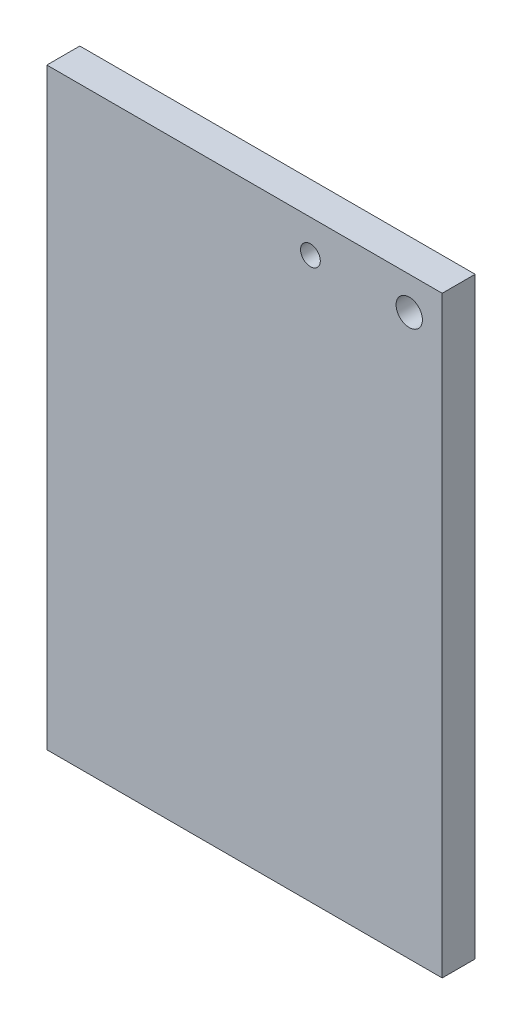
ISO-10303-21;
HEADER;
FILE_DESCRIPTION(('STEP AP214'),'2;1');
FILE_NAME('part.step','',(''),(''),'','','');
FILE_SCHEMA(('AUTOMOTIVE_DESIGN { 1 0 10303 214 1 1 1 1 }'));
ENDSEC;
DATA;
#1=APPLICATION_CONTEXT('core data for automotive mechanical design processes');
#2=APPLICATION_PROTOCOL_DEFINITION('international standard','automotive_design',2000,#1);
#3=PRODUCT_CONTEXT('',#1,'mechanical');
#4=PRODUCT('Part','Part','',(#3));
#5=PRODUCT_RELATED_PRODUCT_CATEGORY('part','',(#4));
#6=PRODUCT_DEFINITION_FORMATION('','',#4);
#7=PRODUCT_DEFINITION_CONTEXT('part definition',#1,'design');
#8=PRODUCT_DEFINITION('design','',#6,#7);
#9=PRODUCT_DEFINITION_SHAPE('','',#8);
#10=(LENGTH_UNIT() NAMED_UNIT(*) SI_UNIT(.MILLI.,.METRE.));
#11=(NAMED_UNIT(*) PLANE_ANGLE_UNIT() SI_UNIT($,.RADIAN.));
#12=(NAMED_UNIT(*) SI_UNIT($,.STERADIAN.) SOLID_ANGLE_UNIT());
#13=UNCERTAINTY_MEASURE_WITH_UNIT(LENGTH_MEASURE(1.E-05),#10,'distance_accuracy_value','');
#14=(GEOMETRIC_REPRESENTATION_CONTEXT(3) GLOBAL_UNCERTAINTY_ASSIGNED_CONTEXT((#13)) GLOBAL_UNIT_ASSIGNED_CONTEXT((#10,
#11,#12)) REPRESENTATION_CONTEXT('',''));
#15=CARTESIAN_POINT('',(0.,0.,0.));
#16=DIRECTION('',(0.,0.,1.));
#17=DIRECTION('',(1.,0.,0.));
#18=AXIS2_PLACEMENT_3D('',#15,#16,#17);
#19=CARTESIAN_POINT('',(0.,0.,5.));
#20=DIRECTION('',(0.,0.,1.));
#21=DIRECTION('',(1.,0.,0.));
#22=AXIS2_PLACEMENT_3D('',#19,#20,#21);
#23=PLANE('',#22);
#24=CARTESIAN_POINT('',(55.,-5.,5.));
#25=DIRECTION('',(0.,0.,1.));
#26=DIRECTION('',(1.,0.,0.));
#27=AXIS2_PLACEMENT_3D('',#24,#25,#26);
#28=CIRCLE('',#27,2.);
#29=CARTESIAN_POINT('',(57.,-5.,5.));
#30=VERTEX_POINT('',#29);
#31=EDGE_CURVE('E99',#30,#30,#28,.T.);
#32=ORIENTED_EDGE('',*,*,#31,.F.);
#33=EDGE_LOOP('',(#32));
#34=FACE_BOUND('',#33,.T.);
#35=DIRECTION('',(0.,-1.,0.));
#36=VECTOR('',#35,1.);
#37=CARTESIAN_POINT('',(0.,0.,5.));
#38=LINE('',#37,#36);
#39=CARTESIAN_POINT('',(0.,0.,5.));
#40=VERTEX_POINT('',#39);
#41=CARTESIAN_POINT('',(0.,-90.,5.));
#42=VERTEX_POINT('',#41);
#43=EDGE_CURVE('E84',#40,#42,#38,.T.);
#44=ORIENTED_EDGE('',*,*,#43,.T.);
#45=DIRECTION('',(1.,0.,0.));
#46=VECTOR('',#45,1.);
#47=CARTESIAN_POINT('',(0.,-90.,5.));
#48=LINE('',#47,#46);
#49=CARTESIAN_POINT('',(60.,-90.,5.));
#50=VERTEX_POINT('',#49);
#51=EDGE_CURVE('E79',#42,#50,#48,.T.);
#52=ORIENTED_EDGE('',*,*,#51,.T.);
#53=DIRECTION('',(0.,1.,0.));
#54=VECTOR('',#53,1.);
#55=CARTESIAN_POINT('',(60.,0.,5.));
#56=LINE('',#55,#54);
#57=CARTESIAN_POINT('',(60.,0.,5.));
#58=VERTEX_POINT('',#57);
#59=EDGE_CURVE('E82',#50,#58,#56,.T.);
#60=ORIENTED_EDGE('',*,*,#59,.T.);
#61=DIRECTION('',(-1.,0.,0.));
#62=VECTOR('',#61,1.);
#63=CARTESIAN_POINT('',(0.,0.,5.));
#64=LINE('',#63,#62);
#65=EDGE_CURVE('E49',#58,#40,#64,.T.);
#66=ORIENTED_EDGE('',*,*,#65,.T.);
#67=EDGE_LOOP('',(#44,#52,#60,#66));
#68=FACE_BOUND('',#67,.T.);
#69=CARTESIAN_POINT('',(40.,-5.,5.));
#70=DIRECTION('',(0.,0.,1.));
#71=DIRECTION('',(1.,0.,0.));
#72=AXIS2_PLACEMENT_3D('',#69,#70,#71);
#73=CIRCLE('',#72,1.5);
#74=CARTESIAN_POINT('',(41.5,-5.,5.));
#75=VERTEX_POINT('',#74);
#76=EDGE_CURVE('E114',#75,#75,#73,.T.);
#77=ORIENTED_EDGE('',*,*,#76,.F.);
#78=EDGE_LOOP('',(#77));
#79=FACE_BOUND('',#78,.T.);
#80=ADVANCED_FACE('F32',(#34,#68,#79),#23,.T.);
#81=CARTESIAN_POINT('',(0.,0.,0.));
#82=DIRECTION('',(0.,0.,1.));
#83=DIRECTION('',(1.,0.,0.));
#84=AXIS2_PLACEMENT_3D('',#81,#82,#83);
#85=PLANE('',#84);
#86=DIRECTION('',(0.,-1.,0.));
#87=VECTOR('',#86,1.);
#88=CARTESIAN_POINT('',(0.,0.,0.));
#89=LINE('',#88,#87);
#90=CARTESIAN_POINT('',(0.,0.,0.));
#91=VERTEX_POINT('',#90);
#92=CARTESIAN_POINT('',(0.,-90.,0.));
#93=VERTEX_POINT('',#92);
#94=EDGE_CURVE('E96',#91,#93,#89,.T.);
#95=ORIENTED_EDGE('',*,*,#94,.F.);
#96=DIRECTION('',(-1.,0.,0.));
#97=VECTOR('',#96,1.);
#98=CARTESIAN_POINT('',(0.,0.,0.));
#99=LINE('',#98,#97);
#100=CARTESIAN_POINT('',(60.,0.,0.));
#101=VERTEX_POINT('',#100);
#102=EDGE_CURVE('E72',#101,#91,#99,.T.);
#103=ORIENTED_EDGE('',*,*,#102,.F.);
#104=DIRECTION('',(0.,1.,0.));
#105=VECTOR('',#104,1.);
#106=CARTESIAN_POINT('',(60.,0.,0.));
#107=LINE('',#106,#105);
#108=CARTESIAN_POINT('',(60.,-90.,0.));
#109=VERTEX_POINT('',#108);
#110=EDGE_CURVE('E66',#109,#101,#107,.T.);
#111=ORIENTED_EDGE('',*,*,#110,.F.);
#112=DIRECTION('',(1.,0.,0.));
#113=VECTOR('',#112,1.);
#114=CARTESIAN_POINT('',(0.,-90.,0.));
#115=LINE('',#114,#113);
#116=EDGE_CURVE('E88',#93,#109,#115,.T.);
#117=ORIENTED_EDGE('',*,*,#116,.F.);
#118=EDGE_LOOP('',(#95,#103,#111,#117));
#119=FACE_BOUND('',#118,.T.);
#120=CARTESIAN_POINT('',(55.,-5.,0.));
#121=DIRECTION('',(0.,0.,1.));
#122=DIRECTION('',(1.,0.,0.));
#123=AXIS2_PLACEMENT_3D('',#120,#121,#122);
#124=CIRCLE('',#123,2.);
#125=CARTESIAN_POINT('',(57.,-5.,0.));
#126=VERTEX_POINT('',#125);
#127=EDGE_CURVE('E111',#126,#126,#124,.T.);
#128=ORIENTED_EDGE('',*,*,#127,.T.);
#129=EDGE_LOOP('',(#128));
#130=FACE_BOUND('',#129,.T.);
#131=CARTESIAN_POINT('',(40.,-5.,0.));
#132=DIRECTION('',(0.,0.,1.));
#133=DIRECTION('',(1.,0.,0.));
#134=AXIS2_PLACEMENT_3D('',#131,#132,#133);
#135=CIRCLE('',#134,1.5);
#136=CARTESIAN_POINT('',(41.5,-5.,0.));
#137=VERTEX_POINT('',#136);
#138=EDGE_CURVE('E117',#137,#137,#135,.T.);
#139=ORIENTED_EDGE('',*,*,#138,.T.);
#140=EDGE_LOOP('',(#139));
#141=FACE_BOUND('',#140,.T.);
#142=ADVANCED_FACE('F107',(#119,#130,#141),#85,.F.);
#143=CARTESIAN_POINT('',(0.,0.,5.));
#144=DIRECTION('',(1.,0.,0.));
#145=DIRECTION('',(0.,1.,0.));
#146=AXIS2_PLACEMENT_3D('',#143,#144,#145);
#147=PLANE('',#146);
#148=ORIENTED_EDGE('',*,*,#94,.T.);
#149=DIRECTION('',(0.,0.,-1.));
#150=VECTOR('',#149,1.);
#151=CARTESIAN_POINT('',(0.,-90.,5.));
#152=LINE('',#151,#150);
#153=EDGE_CURVE('E11',#42,#93,#152,.T.);
#154=ORIENTED_EDGE('',*,*,#153,.F.);
#155=ORIENTED_EDGE('',*,*,#43,.F.);
#156=DIRECTION('',(0.,0.,-1.));
#157=VECTOR('',#156,1.);
#158=CARTESIAN_POINT('',(0.,0.,5.));
#159=LINE('',#158,#157);
#160=EDGE_CURVE('E92',#40,#91,#159,.T.);
#161=ORIENTED_EDGE('',*,*,#160,.T.);
#162=EDGE_LOOP('',(#148,#154,#155,#161));
#163=FACE_BOUND('',#162,.T.);
#164=ADVANCED_FACE('F34',(#163),#147,.F.);
#165=CARTESIAN_POINT('',(0.,-90.,5.));
#166=DIRECTION('',(0.,1.,0.));
#167=DIRECTION('',(0.,0.,1.));
#168=AXIS2_PLACEMENT_3D('',#165,#166,#167);
#169=PLANE('',#168);
#170=ORIENTED_EDGE('',*,*,#116,.T.);
#171=DIRECTION('',(0.,0.,-1.));
#172=VECTOR('',#171,1.);
#173=CARTESIAN_POINT('',(60.,-90.,5.));
#174=LINE('',#173,#172);
#175=EDGE_CURVE('E41',#50,#109,#174,.T.);
#176=ORIENTED_EDGE('',*,*,#175,.F.);
#177=ORIENTED_EDGE('',*,*,#51,.F.);
#178=ORIENTED_EDGE('',*,*,#153,.T.);
#179=EDGE_LOOP('',(#170,#176,#177,#178));
#180=FACE_BOUND('',#179,.T.);
#181=ADVANCED_FACE('F87',(#180),#169,.F.);
#182=CARTESIAN_POINT('',(60.,0.,5.));
#183=DIRECTION('',(-1.,0.,0.));
#184=DIRECTION('',(0.,-1.,0.));
#185=AXIS2_PLACEMENT_3D('',#182,#183,#184);
#186=PLANE('',#185);
#187=ORIENTED_EDGE('',*,*,#110,.T.);
#188=DIRECTION('',(0.,0.,-1.));
#189=VECTOR('',#188,1.);
#190=CARTESIAN_POINT('',(60.,0.,5.));
#191=LINE('',#190,#189);
#192=EDGE_CURVE('E89',#58,#101,#191,.T.);
#193=ORIENTED_EDGE('',*,*,#192,.F.);
#194=ORIENTED_EDGE('',*,*,#59,.F.);
#195=ORIENTED_EDGE('',*,*,#175,.T.);
#196=EDGE_LOOP('',(#187,#193,#194,#195));
#197=FACE_BOUND('',#196,.T.);
#198=ADVANCED_FACE('F90',(#197),#186,.F.);
#199=CARTESIAN_POINT('',(0.,0.,5.));
#200=DIRECTION('',(0.,-1.,0.));
#201=DIRECTION('',(0.,0.,-1.));
#202=AXIS2_PLACEMENT_3D('',#199,#200,#201);
#203=PLANE('',#202);
#204=ORIENTED_EDGE('',*,*,#102,.T.);
#205=ORIENTED_EDGE('',*,*,#160,.F.);
#206=ORIENTED_EDGE('',*,*,#65,.F.);
#207=ORIENTED_EDGE('',*,*,#192,.T.);
#208=EDGE_LOOP('',(#204,#205,#206,#207));
#209=FACE_BOUND('',#208,.T.);
#210=ADVANCED_FACE('F104',(#209),#203,.F.);
#211=CARTESIAN_POINT('',(55.,-5.,5.));
#212=DIRECTION('',(0.,0.,-1.));
#213=DIRECTION('',(-1.,0.,0.));
#214=AXIS2_PLACEMENT_3D('',#211,#212,#213);
#215=CYLINDRICAL_SURFACE('',#214,2.);
#216=ORIENTED_EDGE('',*,*,#31,.T.);
#217=EDGE_LOOP('',(#216));
#218=FACE_BOUND('',#217,.T.);
#219=ORIENTED_EDGE('',*,*,#127,.F.);
#220=EDGE_LOOP('',(#219));
#221=FACE_BOUND('',#220,.T.);
#222=ADVANCED_FACE('F134',(#218,#221),#215,.F.);
#223=CARTESIAN_POINT('',(40.,-5.,5.));
#224=DIRECTION('',(0.,0.,-1.));
#225=DIRECTION('',(-1.,0.,0.));
#226=AXIS2_PLACEMENT_3D('',#223,#224,#225);
#227=CYLINDRICAL_SURFACE('',#226,1.5);
#228=ORIENTED_EDGE('',*,*,#76,.T.);
#229=EDGE_LOOP('',(#228));
#230=FACE_BOUND('',#229,.T.);
#231=ORIENTED_EDGE('',*,*,#138,.F.);
#232=EDGE_LOOP('',(#231));
#233=FACE_BOUND('',#232,.T.);
#234=ADVANCED_FACE('F123',(#230,#233),#227,.F.);
#235=CLOSED_SHELL('',(#80,#142,#164,#181,#198,#210,#222,#234));
#236=MANIFOLD_SOLID_BREP('B2',#235);
#237=ADVANCED_BREP_SHAPE_REPRESENTATION('',(#18,#236),#14);
#238=SHAPE_DEFINITION_REPRESENTATION(#9,#237);
ENDSEC;
END-ISO-10303-21;
